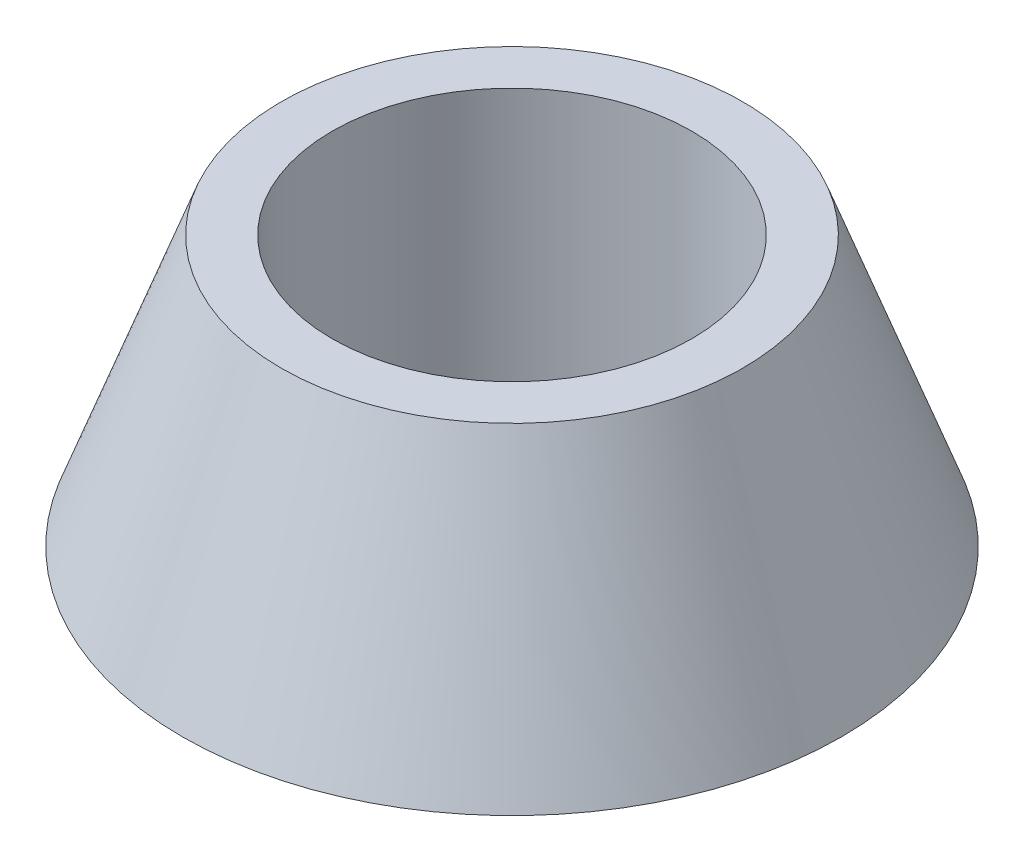
ISO-10303-21;
HEADER;
FILE_DESCRIPTION(('STEP AP214'),'2;1');
FILE_NAME('part.step','',(''),(''),'','','');
FILE_SCHEMA(('AUTOMOTIVE_DESIGN { 1 0 10303 214 1 1 1 1 }'));
ENDSEC;
DATA;
#1=APPLICATION_CONTEXT('core data for automotive mechanical design processes');
#2=APPLICATION_PROTOCOL_DEFINITION('international standard','automotive_design',2000,#1);
#3=PRODUCT_CONTEXT('',#1,'mechanical');
#4=PRODUCT('Part','Part','',(#3));
#5=PRODUCT_RELATED_PRODUCT_CATEGORY('part','',(#4));
#6=PRODUCT_DEFINITION_FORMATION('','',#4);
#7=PRODUCT_DEFINITION_CONTEXT('part definition',#1,'design');
#8=PRODUCT_DEFINITION('design','',#6,#7);
#9=PRODUCT_DEFINITION_SHAPE('','',#8);
#10=(LENGTH_UNIT() NAMED_UNIT(*) SI_UNIT(.MILLI.,.METRE.));
#11=(NAMED_UNIT(*) PLANE_ANGLE_UNIT() SI_UNIT($,.RADIAN.));
#12=(NAMED_UNIT(*) SI_UNIT($,.STERADIAN.) SOLID_ANGLE_UNIT());
#13=UNCERTAINTY_MEASURE_WITH_UNIT(LENGTH_MEASURE(1.E-05),#10,'distance_accuracy_value','');
#14=(GEOMETRIC_REPRESENTATION_CONTEXT(3) GLOBAL_UNCERTAINTY_ASSIGNED_CONTEXT((#13)) GLOBAL_UNIT_ASSIGNED_CONTEXT((#10,
#11,#12)) REPRESENTATION_CONTEXT('',''));
#15=CARTESIAN_POINT('',(0.,0.,0.));
#16=DIRECTION('',(0.,0.,1.));
#17=DIRECTION('',(1.,0.,0.));
#18=AXIS2_PLACEMENT_3D('',#15,#16,#17);
#19=CARTESIAN_POINT('',(7.7,4.5,0.));
#20=DIRECTION('',(0.,-1.,0.));
#21=DIRECTION('',(0.,0.,-1.));
#22=AXIS2_PLACEMENT_3D('',#19,#20,#21);
#23=PLANE('',#22);
#24=CARTESIAN_POINT('',(0.,4.5,0.));
#25=DIRECTION('',(0.,1.,0.));
#26=DIRECTION('',(0.,0.,1.));
#27=AXIS2_PLACEMENT_3D('',#24,#25,#26);
#28=CIRCLE('',#27,6.);
#29=CARTESIAN_POINT('',(0.,4.5,6.));
#30=VERTEX_POINT('',#29);
#31=EDGE_CURVE('E10',#30,#30,#28,.T.);
#32=ORIENTED_EDGE('',*,*,#31,.F.);
#33=EDGE_LOOP('',(#32));
#34=FACE_BOUND('',#33,.T.);
#35=CARTESIAN_POINT('',(0.,4.5,0.));
#36=DIRECTION('',(0.,1.,0.));
#37=DIRECTION('',(0.,0.,1.));
#38=AXIS2_PLACEMENT_3D('',#35,#36,#37);
#39=CIRCLE('',#38,7.7);
#40=CARTESIAN_POINT('',(0.,4.5,7.7));
#41=VERTEX_POINT('',#40);
#42=EDGE_CURVE('E46',#41,#41,#39,.T.);
#43=ORIENTED_EDGE('',*,*,#42,.T.);
#44=EDGE_LOOP('',(#43));
#45=FACE_BOUND('',#44,.T.);
#46=ADVANCED_FACE('F32',(#34,#45),#23,.F.);
#47=CARTESIAN_POINT('',(0.,7.92070823611316,0.));
#48=DIRECTION('',(0.,1.,0.));
#49=DIRECTION('',(0.,0.,1.));
#50=AXIS2_PLACEMENT_3D('',#47,#48,#49);
#51=CYLINDRICAL_SURFACE('',#50,6.);
#52=CARTESIAN_POINT('',(0.,-4.5,0.));
#53=DIRECTION('',(0.,1.,0.));
#54=DIRECTION('',(0.,0.,1.));
#55=AXIS2_PLACEMENT_3D('',#52,#53,#54);
#56=CIRCLE('',#55,6.);
#57=CARTESIAN_POINT('',(0.,-4.5,6.));
#58=VERTEX_POINT('',#57);
#59=EDGE_CURVE('E38',#58,#58,#56,.T.);
#60=ORIENTED_EDGE('',*,*,#59,.F.);
#61=EDGE_LOOP('',(#60));
#62=FACE_BOUND('',#61,.T.);
#63=ORIENTED_EDGE('',*,*,#31,.T.);
#64=EDGE_LOOP('',(#63));
#65=FACE_BOUND('',#64,.T.);
#66=ADVANCED_FACE('F61',(#62,#65),#51,.F.);
#67=CARTESIAN_POINT('',(6.,-4.5,0.));
#68=DIRECTION('',(0.,1.,0.));
#69=DIRECTION('',(0.,0.,1.));
#70=AXIS2_PLACEMENT_3D('',#67,#68,#69);
#71=PLANE('',#70);
#72=CARTESIAN_POINT('',(0.,-4.5,0.));
#73=DIRECTION('',(0.,1.,0.));
#74=DIRECTION('',(0.,0.,1.));
#75=AXIS2_PLACEMENT_3D('',#72,#73,#74);
#76=CIRCLE('',#75,11.);
#77=CARTESIAN_POINT('',(0.,-4.5,11.));
#78=VERTEX_POINT('',#77);
#79=EDGE_CURVE('E42',#78,#78,#76,.T.);
#80=ORIENTED_EDGE('',*,*,#79,.F.);
#81=EDGE_LOOP('',(#80));
#82=FACE_BOUND('',#81,.T.);
#83=ORIENTED_EDGE('',*,*,#59,.T.);
#84=EDGE_LOOP('',(#83));
#85=FACE_BOUND('',#84,.T.);
#86=ADVANCED_FACE('F56',(#82,#85),#71,.F.);
#87=CARTESIAN_POINT('',(0.,-4.5,0.));
#88=DIRECTION('',(0.,-1.,0.));
#89=DIRECTION('',(0.,0.,-1.));
#90=AXIS2_PLACEMENT_3D('',#87,#88,#89);
#91=CONICAL_SURFACE('',#90,11.,0.351444794003552);
#92=ORIENTED_EDGE('',*,*,#42,.F.);
#93=EDGE_LOOP('',(#92));
#94=FACE_BOUND('',#93,.T.);
#95=ORIENTED_EDGE('',*,*,#79,.T.);
#96=EDGE_LOOP('',(#95));
#97=FACE_BOUND('',#96,.T.);
#98=ADVANCED_FACE('F53',(#94,#97),#91,.T.);
#99=CLOSED_SHELL('',(#46,#66,#86,#98));
#100=MANIFOLD_SOLID_BREP('B2',#99);
#101=ADVANCED_BREP_SHAPE_REPRESENTATION('',(#18,#100),#14);
#102=SHAPE_DEFINITION_REPRESENTATION(#9,#101);
ENDSEC;
END-ISO-10303-21;
